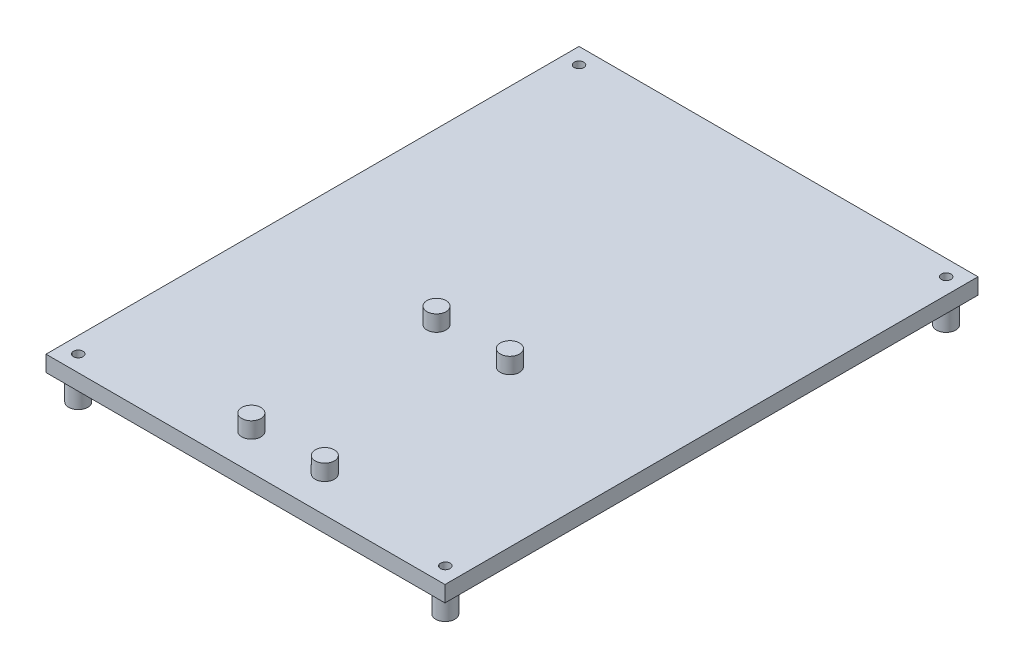
ISO-10303-21;
HEADER;
FILE_DESCRIPTION(('STEP AP214'),'2;1');
FILE_NAME('part.step','',(''),(''),'','','');
FILE_SCHEMA(('AUTOMOTIVE_DESIGN { 1 0 10303 214 1 1 1 1 }'));
ENDSEC;
DATA;
#1=APPLICATION_CONTEXT('core data for automotive mechanical design processes');
#2=APPLICATION_PROTOCOL_DEFINITION('international standard','automotive_design',2000,#1);
#3=PRODUCT_CONTEXT('',#1,'mechanical');
#4=PRODUCT('Part','Part','',(#3));
#5=PRODUCT_RELATED_PRODUCT_CATEGORY('part','',(#4));
#6=PRODUCT_DEFINITION_FORMATION('','',#4);
#7=PRODUCT_DEFINITION_CONTEXT('part definition',#1,'design');
#8=PRODUCT_DEFINITION('design','',#6,#7);
#9=PRODUCT_DEFINITION_SHAPE('','',#8);
#10=(LENGTH_UNIT() NAMED_UNIT(*) SI_UNIT(.MILLI.,.METRE.));
#11=(NAMED_UNIT(*) PLANE_ANGLE_UNIT() SI_UNIT($,.RADIAN.));
#12=(NAMED_UNIT(*) SI_UNIT($,.STERADIAN.) SOLID_ANGLE_UNIT());
#13=UNCERTAINTY_MEASURE_WITH_UNIT(LENGTH_MEASURE(1.E-05),#10,'distance_accuracy_value','');
#14=(GEOMETRIC_REPRESENTATION_CONTEXT(3) GLOBAL_UNCERTAINTY_ASSIGNED_CONTEXT((#13)) GLOBAL_UNIT_ASSIGNED_CONTEXT((#10,
#11,#12)) REPRESENTATION_CONTEXT('',''));
#15=CARTESIAN_POINT('',(0.,0.,0.));
#16=DIRECTION('',(0.,0.,1.));
#17=DIRECTION('',(1.,0.,0.));
#18=AXIS2_PLACEMENT_3D('',#15,#16,#17);
#19=CARTESIAN_POINT('',(62.5,5.,83.5));
#20=DIRECTION('',(-1.,0.,0.));
#21=DIRECTION('',(0.,0.,1.));
#22=AXIS2_PLACEMENT_3D('',#19,#20,#21);
#23=PLANE('',#22);
#24=DIRECTION('',(0.,0.,-1.));
#25=VECTOR('',#24,1.);
#26=CARTESIAN_POINT('',(62.5,0.,83.5));
#27=LINE('',#26,#25);
#28=CARTESIAN_POINT('',(62.5,0.,83.5));
#29=VERTEX_POINT('',#28);
#30=CARTESIAN_POINT('',(62.5,0.,-83.5));
#31=VERTEX_POINT('',#30);
#32=EDGE_CURVE('E108',#29,#31,#27,.T.);
#33=ORIENTED_EDGE('',*,*,#32,.T.);
#34=DIRECTION('',(0.,-1.,0.));
#35=VECTOR('',#34,1.);
#36=CARTESIAN_POINT('',(62.5,5.,-83.5));
#37=LINE('',#36,#35);
#38=CARTESIAN_POINT('',(62.5,5.,-83.5));
#39=VERTEX_POINT('',#38);
#40=EDGE_CURVE('E99',#39,#31,#37,.T.);
#41=ORIENTED_EDGE('',*,*,#40,.F.);
#42=DIRECTION('',(0.,0.,-1.));
#43=VECTOR('',#42,1.);
#44=CARTESIAN_POINT('',(62.5,5.,83.5));
#45=LINE('',#44,#43);
#46=CARTESIAN_POINT('',(62.5,5.,83.5));
#47=VERTEX_POINT('',#46);
#48=EDGE_CURVE('E93',#47,#39,#45,.T.);
#49=ORIENTED_EDGE('',*,*,#48,.F.);
#50=DIRECTION('',(0.,-1.,0.));
#51=VECTOR('',#50,1.);
#52=CARTESIAN_POINT('',(62.5,5.,83.5));
#53=LINE('',#52,#51);
#54=EDGE_CURVE('E104',#47,#29,#53,.T.);
#55=ORIENTED_EDGE('',*,*,#54,.T.);
#56=EDGE_LOOP('',(#33,#41,#49,#55));
#57=FACE_BOUND('',#56,.T.);
#58=ADVANCED_FACE('F41',(#57),#23,.F.);
#59=CARTESIAN_POINT('',(-62.5,5.,-83.5));
#60=DIRECTION('',(0.,0.,1.));
#61=DIRECTION('',(1.,0.,0.));
#62=AXIS2_PLACEMENT_3D('',#59,#60,#61);
#63=PLANE('',#62);
#64=DIRECTION('',(-1.,0.,0.));
#65=VECTOR('',#64,1.);
#66=CARTESIAN_POINT('',(-62.5,0.,-83.5));
#67=LINE('',#66,#65);
#68=CARTESIAN_POINT('',(-62.5,0.,-83.5));
#69=VERTEX_POINT('',#68);
#70=EDGE_CURVE('E98',#31,#69,#67,.T.);
#71=ORIENTED_EDGE('',*,*,#70,.T.);
#72=DIRECTION('',(0.,-1.,0.));
#73=VECTOR('',#72,1.);
#74=CARTESIAN_POINT('',(-62.5,5.,-83.5));
#75=LINE('',#74,#73);
#76=CARTESIAN_POINT('',(-62.5,5.,-83.5));
#77=VERTEX_POINT('',#76);
#78=EDGE_CURVE('E96',#77,#69,#75,.T.);
#79=ORIENTED_EDGE('',*,*,#78,.F.);
#80=DIRECTION('',(-1.,0.,0.));
#81=VECTOR('',#80,1.);
#82=CARTESIAN_POINT('',(-62.5,5.,-83.5));
#83=LINE('',#82,#81);
#84=EDGE_CURVE('E88',#39,#77,#83,.T.);
#85=ORIENTED_EDGE('',*,*,#84,.F.);
#86=ORIENTED_EDGE('',*,*,#40,.T.);
#87=EDGE_LOOP('',(#71,#79,#85,#86));
#88=FACE_BOUND('',#87,.T.);
#89=ADVANCED_FACE('F97',(#88),#63,.F.);
#90=CARTESIAN_POINT('',(-62.5,5.,83.5));
#91=DIRECTION('',(1.,0.,0.));
#92=DIRECTION('',(0.,0.,-1.));
#93=AXIS2_PLACEMENT_3D('',#90,#91,#92);
#94=PLANE('',#93);
#95=DIRECTION('',(0.,0.,1.));
#96=VECTOR('',#95,1.);
#97=CARTESIAN_POINT('',(-62.5,0.,83.5));
#98=LINE('',#97,#96);
#99=CARTESIAN_POINT('',(-62.5,0.,83.5));
#100=VERTEX_POINT('',#99);
#101=EDGE_CURVE('E74',#69,#100,#98,.T.);
#102=ORIENTED_EDGE('',*,*,#101,.T.);
#103=DIRECTION('',(0.,-1.,0.));
#104=VECTOR('',#103,1.);
#105=CARTESIAN_POINT('',(-62.5,5.,83.5));
#106=LINE('',#105,#104);
#107=CARTESIAN_POINT('',(-62.5,5.,83.5));
#108=VERTEX_POINT('',#107);
#109=EDGE_CURVE('E100',#108,#100,#106,.T.);
#110=ORIENTED_EDGE('',*,*,#109,.F.);
#111=DIRECTION('',(0.,0.,1.));
#112=VECTOR('',#111,1.);
#113=CARTESIAN_POINT('',(-62.5,5.,83.5));
#114=LINE('',#113,#112);
#115=EDGE_CURVE('E91',#77,#108,#114,.T.);
#116=ORIENTED_EDGE('',*,*,#115,.F.);
#117=ORIENTED_EDGE('',*,*,#78,.T.);
#118=EDGE_LOOP('',(#102,#110,#116,#117));
#119=FACE_BOUND('',#118,.T.);
#120=ADVANCED_FACE('F102',(#119),#94,.F.);
#121=CARTESIAN_POINT('',(-62.5,5.,83.5));
#122=DIRECTION('',(0.,0.,-1.));
#123=DIRECTION('',(-1.,0.,0.));
#124=AXIS2_PLACEMENT_3D('',#121,#122,#123);
#125=PLANE('',#124);
#126=DIRECTION('',(1.,0.,0.));
#127=VECTOR('',#126,1.);
#128=CARTESIAN_POINT('',(-62.5,0.,83.5));
#129=LINE('',#128,#127);
#130=EDGE_CURVE('E80',#100,#29,#129,.T.);
#131=ORIENTED_EDGE('',*,*,#130,.T.);
#132=ORIENTED_EDGE('',*,*,#54,.F.);
#133=DIRECTION('',(1.,0.,0.));
#134=VECTOR('',#133,1.);
#135=CARTESIAN_POINT('',(-62.5,5.,83.5));
#136=LINE('',#135,#134);
#137=EDGE_CURVE('E57',#108,#47,#136,.T.);
#138=ORIENTED_EDGE('',*,*,#137,.F.);
#139=ORIENTED_EDGE('',*,*,#109,.T.);
#140=EDGE_LOOP('',(#131,#132,#138,#139));
#141=FACE_BOUND('',#140,.T.);
#142=ADVANCED_FACE('F131',(#141),#125,.F.);
#143=CARTESIAN_POINT('',(0.,5.,0.));
#144=DIRECTION('',(0.,-1.,0.));
#145=DIRECTION('',(0.,0.,-1.));
#146=AXIS2_PLACEMENT_3D('',#143,#144,#145);
#147=PLANE('',#146);
#148=CARTESIAN_POINT('',(13.6315538342509,5.,72.2889562249022));
#149=DIRECTION('',(0.,-1.,0.));
#150=DIRECTION('',(0.,0.,-1.));
#151=AXIS2_PLACEMENT_3D('',#148,#149,#150);
#152=CIRCLE('',#151,3.);
#153=CARTESIAN_POINT('',(13.6315538342509,5.,69.2889562249022));
#154=VERTEX_POINT('',#153);
#155=EDGE_CURVE('E11',#154,#154,#152,.F.);
#156=ORIENTED_EDGE('',*,*,#155,.F.);
#157=EDGE_LOOP('',(#156));
#158=FACE_BOUND('',#157,.T.);
#159=CARTESIAN_POINT('',(13.6315538342509,5.,14.2889562249022));
#160=DIRECTION('',(0.,-1.,0.));
#161=DIRECTION('',(0.,0.,-1.));
#162=AXIS2_PLACEMENT_3D('',#159,#160,#161);
#163=CIRCLE('',#162,3.);
#164=CARTESIAN_POINT('',(13.6315538342509,5.,11.2889562249022));
#165=VERTEX_POINT('',#164);
#166=EDGE_CURVE('E49',#165,#165,#163,.F.);
#167=ORIENTED_EDGE('',*,*,#166,.F.);
#168=EDGE_LOOP('',(#167));
#169=FACE_BOUND('',#168,.T.);
#170=CARTESIAN_POINT('',(-9.36844616574911,5.,14.2889562249022));
#171=DIRECTION('',(0.,-1.,0.));
#172=DIRECTION('',(0.,0.,-1.));
#173=AXIS2_PLACEMENT_3D('',#170,#171,#172);
#174=CIRCLE('',#173,3.);
#175=CARTESIAN_POINT('',(-9.36844616574911,5.,11.2889562249022));
#176=VERTEX_POINT('',#175);
#177=EDGE_CURVE('E121',#176,#176,#174,.F.);
#178=ORIENTED_EDGE('',*,*,#177,.F.);
#179=EDGE_LOOP('',(#178));
#180=FACE_BOUND('',#179,.T.);
#181=CARTESIAN_POINT('',(-9.36844616574911,5.,72.2889562249022));
#182=DIRECTION('',(0.,-1.,0.));
#183=DIRECTION('',(0.,0.,-1.));
#184=AXIS2_PLACEMENT_3D('',#181,#182,#183);
#185=CIRCLE('',#184,3.);
#186=CARTESIAN_POINT('',(-9.36844616574911,5.,69.2889562249022));
#187=VERTEX_POINT('',#186);
#188=EDGE_CURVE('E118',#187,#187,#185,.F.);
#189=ORIENTED_EDGE('',*,*,#188,.F.);
#190=EDGE_LOOP('',(#189));
#191=FACE_BOUND('',#190,.T.);
#192=CARTESIAN_POINT('',(-57.5,5.,-78.5));
#193=DIRECTION('',(0.,-1.,0.));
#194=DIRECTION('',(0.,0.,-1.));
#195=AXIS2_PLACEMENT_3D('',#192,#193,#194);
#196=CIRCLE('',#195,1.5);
#197=CARTESIAN_POINT('',(-57.5,5.,-77.));
#198=VERTEX_POINT('',#197);
#199=EDGE_CURVE('E141',#198,#198,#196,.T.);
#200=ORIENTED_EDGE('',*,*,#199,.T.);
#201=EDGE_LOOP('',(#200));
#202=FACE_BOUND('',#201,.T.);
#203=CARTESIAN_POINT('',(57.5,5.,-78.5));
#204=DIRECTION('',(0.,-1.,0.));
#205=DIRECTION('',(0.,0.,-1.));
#206=AXIS2_PLACEMENT_3D('',#203,#204,#205);
#207=CIRCLE('',#206,1.5);
#208=CARTESIAN_POINT('',(57.5,5.,-77.));
#209=VERTEX_POINT('',#208);
#210=EDGE_CURVE('E145',#209,#209,#207,.T.);
#211=ORIENTED_EDGE('',*,*,#210,.T.);
#212=EDGE_LOOP('',(#211));
#213=FACE_BOUND('',#212,.T.);
#214=CARTESIAN_POINT('',(57.5,5.,78.4));
#215=DIRECTION('',(0.,-1.,0.));
#216=DIRECTION('',(0.,0.,-1.));
#217=AXIS2_PLACEMENT_3D('',#214,#215,#216);
#218=CIRCLE('',#217,1.5);
#219=CARTESIAN_POINT('',(57.5,5.,79.9));
#220=VERTEX_POINT('',#219);
#221=EDGE_CURVE('E149',#220,#220,#218,.T.);
#222=ORIENTED_EDGE('',*,*,#221,.T.);
#223=EDGE_LOOP('',(#222));
#224=FACE_BOUND('',#223,.T.);
#225=CARTESIAN_POINT('',(-57.5,5.,78.4));
#226=DIRECTION('',(0.,-1.,0.));
#227=DIRECTION('',(0.,0.,-1.));
#228=AXIS2_PLACEMENT_3D('',#225,#226,#227);
#229=CIRCLE('',#228,1.5);
#230=CARTESIAN_POINT('',(-57.5,5.,79.9));
#231=VERTEX_POINT('',#230);
#232=EDGE_CURVE('E111',#231,#231,#229,.T.);
#233=ORIENTED_EDGE('',*,*,#232,.T.);
#234=EDGE_LOOP('',(#233));
#235=FACE_BOUND('',#234,.T.);
#236=ORIENTED_EDGE('',*,*,#48,.T.);
#237=ORIENTED_EDGE('',*,*,#84,.T.);
#238=ORIENTED_EDGE('',*,*,#115,.T.);
#239=ORIENTED_EDGE('',*,*,#137,.T.);
#240=EDGE_LOOP('',(#236,#237,#238,#239));
#241=FACE_BOUND('',#240,.T.);
#242=ADVANCED_FACE('F89',(#158,#169,#180,#191,#202,#213,#224,#235,#241),#147,.F.);
#243=CARTESIAN_POINT('',(0.,0.,0.));
#244=DIRECTION('',(0.,-1.,0.));
#245=DIRECTION('',(0.,0.,-1.));
#246=AXIS2_PLACEMENT_3D('',#243,#244,#245);
#247=PLANE('',#246);
#248=CARTESIAN_POINT('',(-57.5,0.,-78.5));
#249=DIRECTION('',(0.,-1.,0.));
#250=DIRECTION('',(0.,0.,-1.));
#251=AXIS2_PLACEMENT_3D('',#248,#249,#250);
#252=CIRCLE('',#251,2.99215131836085);
#253=CARTESIAN_POINT('',(-57.5,0.,-81.4921513183609));
#254=VERTEX_POINT('',#253);
#255=EDGE_CURVE('E168',#254,#254,#252,.T.);
#256=ORIENTED_EDGE('',*,*,#255,.F.);
#257=EDGE_LOOP('',(#256));
#258=FACE_BOUND('',#257,.T.);
#259=CARTESIAN_POINT('',(57.5,0.,-78.5));
#260=DIRECTION('',(0.,-1.,0.));
#261=DIRECTION('',(0.,0.,-1.));
#262=AXIS2_PLACEMENT_3D('',#259,#260,#261);
#263=CIRCLE('',#262,2.99215131836085);
#264=CARTESIAN_POINT('',(57.5,0.,-81.4921513183609));
#265=VERTEX_POINT('',#264);
#266=EDGE_CURVE('E175',#265,#265,#263,.T.);
#267=ORIENTED_EDGE('',*,*,#266,.F.);
#268=EDGE_LOOP('',(#267));
#269=FACE_BOUND('',#268,.T.);
#270=CARTESIAN_POINT('',(57.5,0.,78.4));
#271=DIRECTION('',(0.,-1.,0.));
#272=DIRECTION('',(0.,0.,-1.));
#273=AXIS2_PLACEMENT_3D('',#270,#271,#272);
#274=CIRCLE('',#273,2.99215131836085);
#275=CARTESIAN_POINT('',(57.5,0.,75.4078486816392));
#276=VERTEX_POINT('',#275);
#277=EDGE_CURVE('E162',#276,#276,#274,.T.);
#278=ORIENTED_EDGE('',*,*,#277,.F.);
#279=EDGE_LOOP('',(#278));
#280=FACE_BOUND('',#279,.T.);
#281=CARTESIAN_POINT('',(-57.5,0.,78.4));
#282=DIRECTION('',(0.,-1.,0.));
#283=DIRECTION('',(0.,0.,-1.));
#284=AXIS2_PLACEMENT_3D('',#281,#282,#283);
#285=CIRCLE('',#284,2.99215131836085);
#286=CARTESIAN_POINT('',(-57.5,0.,75.4078486816392));
#287=VERTEX_POINT('',#286);
#288=EDGE_CURVE('E159',#287,#287,#285,.T.);
#289=ORIENTED_EDGE('',*,*,#288,.F.);
#290=EDGE_LOOP('',(#289));
#291=FACE_BOUND('',#290,.T.);
#292=ORIENTED_EDGE('',*,*,#32,.F.);
#293=ORIENTED_EDGE('',*,*,#130,.F.);
#294=ORIENTED_EDGE('',*,*,#101,.F.);
#295=ORIENTED_EDGE('',*,*,#70,.F.);
#296=EDGE_LOOP('',(#292,#293,#294,#295));
#297=FACE_BOUND('',#296,.T.);
#298=ADVANCED_FACE('F130',(#258,#269,#280,#291,#297),#247,.T.);
#299=CARTESIAN_POINT('',(-57.5,-1.2E-05,78.4));
#300=DIRECTION('',(0.,1.,0.));
#301=DIRECTION('',(0.,0.,1.));
#302=AXIS2_PLACEMENT_3D('',#299,#300,#301);
#303=CYLINDRICAL_SURFACE('',#302,1.5);
#304=CARTESIAN_POINT('',(-57.5,-8.,78.4));
#305=DIRECTION('',(0.,1.,0.));
#306=DIRECTION('',(0.,0.,1.));
#307=AXIS2_PLACEMENT_3D('',#304,#305,#306);
#308=CIRCLE('',#307,1.5);
#309=CARTESIAN_POINT('',(-57.5,-8.,79.9));
#310=VERTEX_POINT('',#309);
#311=EDGE_CURVE('E186',#310,#310,#308,.T.);
#312=CARTESIAN_POINT('',(-57.5,5.,79.9));
#313=CARTESIAN_POINT('',(-57.5,4.86458333333333,79.9));
#314=CARTESIAN_POINT('',(-57.5,4.72916666666667,79.9));
#315=CARTESIAN_POINT('',(-57.5,4.45833333333333,79.9));
#316=CARTESIAN_POINT('',(-57.5,4.32291666666667,79.9));
#317=CARTESIAN_POINT('',(-57.5,4.05208333333333,79.9));
#318=CARTESIAN_POINT('',(-57.5,3.91666666666667,79.9));
#319=CARTESIAN_POINT('',(-57.5,3.64583333333333,79.9));
#320=CARTESIAN_POINT('',(-57.5,3.51041666666667,79.9));
#321=CARTESIAN_POINT('',(-57.5,3.23958333333333,79.9));
#322=CARTESIAN_POINT('',(-57.5,3.10416666666667,79.9));
#323=CARTESIAN_POINT('',(-57.5,2.83333333333333,79.9));
#324=CARTESIAN_POINT('',(-57.5,2.69791666666667,79.9));
#325=CARTESIAN_POINT('',(-57.5,2.42708333333333,79.9));
#326=CARTESIAN_POINT('',(-57.5,2.29166666666667,79.9));
#327=CARTESIAN_POINT('',(-57.5,2.02083333333333,79.9));
#328=CARTESIAN_POINT('',(-57.5,1.88541666666667,79.9));
#329=CARTESIAN_POINT('',(-57.5,1.61458333333333,79.9));
#330=CARTESIAN_POINT('',(-57.5,1.47916666666667,79.9));
#331=CARTESIAN_POINT('',(-57.5,1.20833333333333,79.9));
#332=CARTESIAN_POINT('',(-57.5,1.07291666666667,79.9));
#333=CARTESIAN_POINT('',(-57.5,0.802083333333333,79.9));
#334=CARTESIAN_POINT('',(-57.5,0.666666666666667,79.9));
#335=CARTESIAN_POINT('',(-57.5,0.395833333333333,79.9));
#336=CARTESIAN_POINT('',(-57.5,0.260416666666667,79.9));
#337=CARTESIAN_POINT('',(-57.5,-0.0104166666666669,79.9));
#338=CARTESIAN_POINT('',(-57.5,-0.145833333333334,79.9));
#339=CARTESIAN_POINT('',(-57.5,-0.416666666666667,79.9));
#340=CARTESIAN_POINT('',(-57.5,-0.552083333333333,79.9));
#341=CARTESIAN_POINT('',(-57.5,-0.822916666666667,79.9));
#342=CARTESIAN_POINT('',(-57.5,-0.958333333333333,79.9));
#343=CARTESIAN_POINT('',(-57.5,-1.22916666666667,79.9));
#344=CARTESIAN_POINT('',(-57.5,-1.36458333333333,79.9));
#345=CARTESIAN_POINT('',(-57.5,-1.63541666666667,79.9));
#346=CARTESIAN_POINT('',(-57.5,-1.77083333333333,79.9));
#347=CARTESIAN_POINT('',(-57.5,-2.04166666666667,79.9));
#348=CARTESIAN_POINT('',(-57.5,-2.17708333333333,79.9));
#349=CARTESIAN_POINT('',(-57.5,-2.44791666666667,79.9));
#350=CARTESIAN_POINT('',(-57.5,-2.58333333333333,79.9));
#351=CARTESIAN_POINT('',(-57.5,-2.85416666666667,79.9));
#352=CARTESIAN_POINT('',(-57.5,-2.98958333333333,79.9));
#353=CARTESIAN_POINT('',(-57.5,-3.26041666666667,79.9));
#354=CARTESIAN_POINT('',(-57.5,-3.39583333333333,79.9));
#355=CARTESIAN_POINT('',(-57.5,-3.66666666666667,79.9));
#356=CARTESIAN_POINT('',(-57.5,-3.80208333333333,79.9));
#357=CARTESIAN_POINT('',(-57.5,-4.07291666666667,79.9));
#358=CARTESIAN_POINT('',(-57.5,-4.20833333333333,79.9));
#359=CARTESIAN_POINT('',(-57.5,-4.47916666666667,79.9));
#360=CARTESIAN_POINT('',(-57.5,-4.61458333333333,79.9));
#361=CARTESIAN_POINT('',(-57.5,-4.88541666666667,79.9));
#362=CARTESIAN_POINT('',(-57.5,-5.02083333333333,79.9));
#363=CARTESIAN_POINT('',(-57.5,-5.29166666666667,79.9));
#364=CARTESIAN_POINT('',(-57.5,-5.42708333333333,79.9));
#365=CARTESIAN_POINT('',(-57.5,-5.69791666666667,79.9));
#366=CARTESIAN_POINT('',(-57.5,-5.83333333333334,79.9));
#367=CARTESIAN_POINT('',(-57.5,-6.10416666666667,79.9));
#368=CARTESIAN_POINT('',(-57.5,-6.23958333333333,79.9));
#369=CARTESIAN_POINT('',(-57.5,-6.51041666666667,79.9));
#370=CARTESIAN_POINT('',(-57.5,-6.64583333333333,79.9));
#371=CARTESIAN_POINT('',(-57.5,-6.91666666666667,79.9));
#372=CARTESIAN_POINT('',(-57.5,-7.05208333333333,79.9));
#373=CARTESIAN_POINT('',(-57.5,-7.32291666666667,79.9));
#374=CARTESIAN_POINT('',(-57.5,-7.45833333333333,79.9));
#375=CARTESIAN_POINT('',(-57.5,-7.72916666666667,79.9));
#376=CARTESIAN_POINT('',(-57.5,-7.86458333333333,79.9));
#377=CARTESIAN_POINT('',(-57.5,-8.,79.9));
#378=B_SPLINE_CURVE_WITH_KNOTS('',3,(#312,#313,#314,#315,#316,#317,#318,#319,#320,#321,#322,
#323,#324,#325,#326,#327,#328,#329,#330,#331,#332,#333,#334,#335,#336,#337,#338,#339,#340,#341,
#342,#343,#344,#345,#346,#347,#348,#349,#350,#351,#352,#353,#354,#355,#356,#357,#358,#359,#360,
#361,#362,#363,#364,#365,#366,#367,#368,#369,#370,#371,#372,#373,#374,#375,#376,#377),
.UNSPECIFIED.,.F.,.F.,(4,2,2,2,2,2,2,2,2,2,2,2,2,2,2,2,2,2,2,2,2,2,2,2,2,2,2,2,2,2,2,2,4),(0.,
0.40625,0.812500000000001,1.21875,1.625,2.03125,2.4375,2.84375,3.25,3.65625,4.0625,4.46875,
4.875,5.28125,5.6875,6.09375,6.5,6.90625,7.3125,7.71875,8.125,8.53125,8.9375,9.34375,9.75,
10.15625,10.5625,10.96875,11.375,11.78125,12.1875,12.59375,13.),.UNSPECIFIED.);
#379=EDGE_CURVE('BSEAM230',#231,#310,#378,.T.);
#380=ORIENTED_EDGE('',*,*,#232,.F.);
#381=ORIENTED_EDGE('',*,*,#311,.F.);
#382=ORIENTED_EDGE('',*,*,#379,.T.);
#383=ORIENTED_EDGE('',*,*,#379,.F.);
#384=EDGE_LOOP('',(#380,#382,#381,#383));
#385=FACE_BOUND('',#384,.T.);
#386=ADVANCED_FACE('F230',(#385),#303,.F.);
#387=CARTESIAN_POINT('',(57.5,-1.2E-05,78.4));
#388=DIRECTION('',(0.,1.,0.));
#389=DIRECTION('',(0.,0.,1.));
#390=AXIS2_PLACEMENT_3D('',#387,#388,#389);
#391=CYLINDRICAL_SURFACE('',#390,1.5);
#392=CARTESIAN_POINT('',(57.5,-8.,78.4));
#393=DIRECTION('',(0.,1.,0.));
#394=DIRECTION('',(0.,0.,1.));
#395=AXIS2_PLACEMENT_3D('',#392,#393,#394);
#396=CIRCLE('',#395,1.5);
#397=CARTESIAN_POINT('',(57.5,-8.,79.9));
#398=VERTEX_POINT('',#397);
#399=EDGE_CURVE('E189',#398,#398,#396,.T.);
#400=CARTESIAN_POINT('',(57.5,5.,79.9));
#401=CARTESIAN_POINT('',(57.5,4.86458333333333,79.9));
#402=CARTESIAN_POINT('',(57.5,4.72916666666667,79.9));
#403=CARTESIAN_POINT('',(57.5,4.45833333333333,79.9));
#404=CARTESIAN_POINT('',(57.5,4.32291666666667,79.9));
#405=CARTESIAN_POINT('',(57.5,4.05208333333333,79.9));
#406=CARTESIAN_POINT('',(57.5,3.91666666666667,79.9));
#407=CARTESIAN_POINT('',(57.5,3.64583333333333,79.9));
#408=CARTESIAN_POINT('',(57.5,3.51041666666667,79.9));
#409=CARTESIAN_POINT('',(57.5,3.23958333333333,79.9));
#410=CARTESIAN_POINT('',(57.5,3.10416666666667,79.9));
#411=CARTESIAN_POINT('',(57.5,2.83333333333333,79.9));
#412=CARTESIAN_POINT('',(57.5,2.69791666666667,79.9));
#413=CARTESIAN_POINT('',(57.5,2.42708333333333,79.9));
#414=CARTESIAN_POINT('',(57.5,2.29166666666667,79.9));
#415=CARTESIAN_POINT('',(57.5,2.02083333333333,79.9));
#416=CARTESIAN_POINT('',(57.5,1.88541666666667,79.9));
#417=CARTESIAN_POINT('',(57.5,1.61458333333333,79.9));
#418=CARTESIAN_POINT('',(57.5,1.47916666666667,79.9));
#419=CARTESIAN_POINT('',(57.5,1.20833333333333,79.9));
#420=CARTESIAN_POINT('',(57.5,1.07291666666667,79.9));
#421=CARTESIAN_POINT('',(57.5,0.802083333333333,79.9));
#422=CARTESIAN_POINT('',(57.5,0.666666666666667,79.9));
#423=CARTESIAN_POINT('',(57.5,0.395833333333333,79.9));
#424=CARTESIAN_POINT('',(57.5,0.260416666666667,79.9));
#425=CARTESIAN_POINT('',(57.5,-0.0104166666666669,79.9));
#426=CARTESIAN_POINT('',(57.5,-0.145833333333334,79.9));
#427=CARTESIAN_POINT('',(57.5,-0.416666666666667,79.9));
#428=CARTESIAN_POINT('',(57.5,-0.552083333333333,79.9));
#429=CARTESIAN_POINT('',(57.5,-0.822916666666667,79.9));
#430=CARTESIAN_POINT('',(57.5,-0.958333333333333,79.9));
#431=CARTESIAN_POINT('',(57.5,-1.22916666666667,79.9));
#432=CARTESIAN_POINT('',(57.5,-1.36458333333333,79.9));
#433=CARTESIAN_POINT('',(57.5,-1.63541666666667,79.9));
#434=CARTESIAN_POINT('',(57.5,-1.77083333333333,79.9));
#435=CARTESIAN_POINT('',(57.5,-2.04166666666667,79.9));
#436=CARTESIAN_POINT('',(57.5,-2.17708333333333,79.9));
#437=CARTESIAN_POINT('',(57.5,-2.44791666666667,79.9));
#438=CARTESIAN_POINT('',(57.5,-2.58333333333333,79.9));
#439=CARTESIAN_POINT('',(57.5,-2.85416666666667,79.9));
#440=CARTESIAN_POINT('',(57.5,-2.98958333333333,79.9));
#441=CARTESIAN_POINT('',(57.5,-3.26041666666667,79.9));
#442=CARTESIAN_POINT('',(57.5,-3.39583333333333,79.9));
#443=CARTESIAN_POINT('',(57.5,-3.66666666666667,79.9));
#444=CARTESIAN_POINT('',(57.5,-3.80208333333333,79.9));
#445=CARTESIAN_POINT('',(57.5,-4.07291666666667,79.9));
#446=CARTESIAN_POINT('',(57.5,-4.20833333333333,79.9));
#447=CARTESIAN_POINT('',(57.5,-4.47916666666667,79.9));
#448=CARTESIAN_POINT('',(57.5,-4.61458333333333,79.9));
#449=CARTESIAN_POINT('',(57.5,-4.88541666666667,79.9));
#450=CARTESIAN_POINT('',(57.5,-5.02083333333333,79.9));
#451=CARTESIAN_POINT('',(57.5,-5.29166666666667,79.9));
#452=CARTESIAN_POINT('',(57.5,-5.42708333333333,79.9));
#453=CARTESIAN_POINT('',(57.5,-5.69791666666667,79.9));
#454=CARTESIAN_POINT('',(57.5,-5.83333333333334,79.9));
#455=CARTESIAN_POINT('',(57.5,-6.10416666666667,79.9));
#456=CARTESIAN_POINT('',(57.5,-6.23958333333333,79.9));
#457=CARTESIAN_POINT('',(57.5,-6.51041666666667,79.9));
#458=CARTESIAN_POINT('',(57.5,-6.64583333333333,79.9));
#459=CARTESIAN_POINT('',(57.5,-6.91666666666667,79.9));
#460=CARTESIAN_POINT('',(57.5,-7.05208333333333,79.9));
#461=CARTESIAN_POINT('',(57.5,-7.32291666666667,79.9));
#462=CARTESIAN_POINT('',(57.5,-7.45833333333333,79.9));
#463=CARTESIAN_POINT('',(57.5,-7.72916666666667,79.9));
#464=CARTESIAN_POINT('',(57.5,-7.86458333333333,79.9));
#465=CARTESIAN_POINT('',(57.5,-8.,79.9));
#466=B_SPLINE_CURVE_WITH_KNOTS('',3,(#400,#401,#402,#403,#404,#405,#406,#407,#408,#409,#410,
#411,#412,#413,#414,#415,#416,#417,#418,#419,#420,#421,#422,#423,#424,#425,#426,#427,#428,#429,
#430,#431,#432,#433,#434,#435,#436,#437,#438,#439,#440,#441,#442,#443,#444,#445,#446,#447,#448,
#449,#450,#451,#452,#453,#454,#455,#456,#457,#458,#459,#460,#461,#462,#463,#464,#465),
.UNSPECIFIED.,.F.,.F.,(4,2,2,2,2,2,2,2,2,2,2,2,2,2,2,2,2,2,2,2,2,2,2,2,2,2,2,2,2,2,2,2,4),(0.,
0.40625,0.812500000000001,1.21875,1.625,2.03125,2.4375,2.84375,3.25,3.65625,4.0625,4.46875,
4.875,5.28125,5.6875,6.09375,6.5,6.90625,7.3125,7.71875,8.125,8.53125,8.9375,9.34375,9.75,
10.15625,10.5625,10.96875,11.375,11.78125,12.1875,12.59375,13.),.UNSPECIFIED.);
#467=EDGE_CURVE('BSEAM238',#220,#398,#466,.T.);
#468=ORIENTED_EDGE('',*,*,#221,.F.);
#469=ORIENTED_EDGE('',*,*,#399,.F.);
#470=ORIENTED_EDGE('',*,*,#467,.T.);
#471=ORIENTED_EDGE('',*,*,#467,.F.);
#472=EDGE_LOOP('',(#468,#470,#469,#471));
#473=FACE_BOUND('',#472,.T.);
#474=ADVANCED_FACE('F238',(#473),#391,.F.);
#475=CARTESIAN_POINT('',(57.5,-1.2E-05,-78.5));
#476=DIRECTION('',(0.,1.,0.));
#477=DIRECTION('',(0.,0.,1.));
#478=AXIS2_PLACEMENT_3D('',#475,#476,#477);
#479=CYLINDRICAL_SURFACE('',#478,1.5);
#480=CARTESIAN_POINT('',(57.5,-8.,-78.5));
#481=DIRECTION('',(0.,1.,0.));
#482=DIRECTION('',(0.,0.,1.));
#483=AXIS2_PLACEMENT_3D('',#480,#481,#482);
#484=CIRCLE('',#483,1.5);
#485=CARTESIAN_POINT('',(57.5,-8.,-77.));
#486=VERTEX_POINT('',#485);
#487=EDGE_CURVE('E185',#486,#486,#484,.T.);
#488=CARTESIAN_POINT('',(57.5,5.,-77.));
#489=CARTESIAN_POINT('',(57.5,4.86458333333333,-77.));
#490=CARTESIAN_POINT('',(57.5,4.72916666666667,-77.));
#491=CARTESIAN_POINT('',(57.5,4.45833333333333,-77.));
#492=CARTESIAN_POINT('',(57.5,4.32291666666667,-77.));
#493=CARTESIAN_POINT('',(57.5,4.05208333333333,-77.));
#494=CARTESIAN_POINT('',(57.5,3.91666666666667,-77.));
#495=CARTESIAN_POINT('',(57.5,3.64583333333333,-77.));
#496=CARTESIAN_POINT('',(57.5,3.51041666666667,-77.));
#497=CARTESIAN_POINT('',(57.5,3.23958333333333,-77.));
#498=CARTESIAN_POINT('',(57.5,3.10416666666667,-77.));
#499=CARTESIAN_POINT('',(57.5,2.83333333333333,-77.));
#500=CARTESIAN_POINT('',(57.5,2.69791666666667,-77.));
#501=CARTESIAN_POINT('',(57.5,2.42708333333333,-77.));
#502=CARTESIAN_POINT('',(57.5,2.29166666666667,-77.));
#503=CARTESIAN_POINT('',(57.5,2.02083333333333,-77.));
#504=CARTESIAN_POINT('',(57.5,1.88541666666667,-77.));
#505=CARTESIAN_POINT('',(57.5,1.61458333333333,-77.));
#506=CARTESIAN_POINT('',(57.5,1.47916666666667,-77.));
#507=CARTESIAN_POINT('',(57.5,1.20833333333333,-77.));
#508=CARTESIAN_POINT('',(57.5,1.07291666666667,-77.));
#509=CARTESIAN_POINT('',(57.5,0.802083333333333,-77.));
#510=CARTESIAN_POINT('',(57.5,0.666666666666667,-77.));
#511=CARTESIAN_POINT('',(57.5,0.395833333333333,-77.));
#512=CARTESIAN_POINT('',(57.5,0.260416666666667,-77.));
#513=CARTESIAN_POINT('',(57.5,-0.0104166666666669,-77.));
#514=CARTESIAN_POINT('',(57.5,-0.145833333333334,-77.));
#515=CARTESIAN_POINT('',(57.5,-0.416666666666667,-77.));
#516=CARTESIAN_POINT('',(57.5,-0.552083333333333,-77.));
#517=CARTESIAN_POINT('',(57.5,-0.822916666666667,-77.));
#518=CARTESIAN_POINT('',(57.5,-0.958333333333333,-77.));
#519=CARTESIAN_POINT('',(57.5,-1.22916666666667,-77.));
#520=CARTESIAN_POINT('',(57.5,-1.36458333333333,-77.));
#521=CARTESIAN_POINT('',(57.5,-1.63541666666667,-77.));
#522=CARTESIAN_POINT('',(57.5,-1.77083333333333,-77.));
#523=CARTESIAN_POINT('',(57.5,-2.04166666666667,-77.));
#524=CARTESIAN_POINT('',(57.5,-2.17708333333333,-77.));
#525=CARTESIAN_POINT('',(57.5,-2.44791666666667,-77.));
#526=CARTESIAN_POINT('',(57.5,-2.58333333333333,-77.));
#527=CARTESIAN_POINT('',(57.5,-2.85416666666667,-77.));
#528=CARTESIAN_POINT('',(57.5,-2.98958333333333,-77.));
#529=CARTESIAN_POINT('',(57.5,-3.26041666666667,-77.));
#530=CARTESIAN_POINT('',(57.5,-3.39583333333333,-77.));
#531=CARTESIAN_POINT('',(57.5,-3.66666666666667,-77.));
#532=CARTESIAN_POINT('',(57.5,-3.80208333333333,-77.));
#533=CARTESIAN_POINT('',(57.5,-4.07291666666667,-77.));
#534=CARTESIAN_POINT('',(57.5,-4.20833333333333,-77.));
#535=CARTESIAN_POINT('',(57.5,-4.47916666666667,-77.));
#536=CARTESIAN_POINT('',(57.5,-4.61458333333333,-77.));
#537=CARTESIAN_POINT('',(57.5,-4.88541666666667,-77.));
#538=CARTESIAN_POINT('',(57.5,-5.02083333333333,-77.));
#539=CARTESIAN_POINT('',(57.5,-5.29166666666667,-77.));
#540=CARTESIAN_POINT('',(57.5,-5.42708333333333,-77.));
#541=CARTESIAN_POINT('',(57.5,-5.69791666666667,-77.));
#542=CARTESIAN_POINT('',(57.5,-5.83333333333334,-77.));
#543=CARTESIAN_POINT('',(57.5,-6.10416666666667,-77.));
#544=CARTESIAN_POINT('',(57.5,-6.23958333333333,-77.));
#545=CARTESIAN_POINT('',(57.5,-6.51041666666667,-77.));
#546=CARTESIAN_POINT('',(57.5,-6.64583333333333,-77.));
#547=CARTESIAN_POINT('',(57.5,-6.91666666666667,-77.));
#548=CARTESIAN_POINT('',(57.5,-7.05208333333333,-77.));
#549=CARTESIAN_POINT('',(57.5,-7.32291666666667,-77.));
#550=CARTESIAN_POINT('',(57.5,-7.45833333333333,-77.));
#551=CARTESIAN_POINT('',(57.5,-7.72916666666667,-77.));
#552=CARTESIAN_POINT('',(57.5,-7.86458333333333,-77.));
#553=CARTESIAN_POINT('',(57.5,-8.,-77.));
#554=B_SPLINE_CURVE_WITH_KNOTS('',3,(#488,#489,#490,#491,#492,#493,#494,#495,#496,#497,#498,
#499,#500,#501,#502,#503,#504,#505,#506,#507,#508,#509,#510,#511,#512,#513,#514,#515,#516,#517,
#518,#519,#520,#521,#522,#523,#524,#525,#526,#527,#528,#529,#530,#531,#532,#533,#534,#535,#536,
#537,#538,#539,#540,#541,#542,#543,#544,#545,#546,#547,#548,#549,#550,#551,#552,#553),
.UNSPECIFIED.,.F.,.F.,(4,2,2,2,2,2,2,2,2,2,2,2,2,2,2,2,2,2,2,2,2,2,2,2,2,2,2,2,2,2,2,2,4),(0.,
0.40625,0.812500000000001,1.21875,1.625,2.03125,2.4375,2.84375,3.25,3.65625,4.0625,4.46875,
4.875,5.28125,5.6875,6.09375,6.5,6.90625,7.3125,7.71875,8.125,8.53125,8.9375,9.34375,9.75,
10.15625,10.5625,10.96875,11.375,11.78125,12.1875,12.59375,13.),.UNSPECIFIED.);
#555=EDGE_CURVE('BSEAM286',#209,#486,#554,.T.);
#556=ORIENTED_EDGE('',*,*,#210,.F.);
#557=ORIENTED_EDGE('',*,*,#487,.F.);
#558=ORIENTED_EDGE('',*,*,#555,.T.);
#559=ORIENTED_EDGE('',*,*,#555,.F.);
#560=EDGE_LOOP('',(#556,#558,#557,#559));
#561=FACE_BOUND('',#560,.T.);
#562=ADVANCED_FACE('F286',(#561),#479,.F.);
#563=CARTESIAN_POINT('',(-57.5,-1.2E-05,-78.5));
#564=DIRECTION('',(0.,1.,0.));
#565=DIRECTION('',(0.,0.,1.));
#566=AXIS2_PLACEMENT_3D('',#563,#564,#565);
#567=CYLINDRICAL_SURFACE('',#566,1.5);
#568=CARTESIAN_POINT('',(-57.5,-8.,-78.5));
#569=DIRECTION('',(0.,1.,0.));
#570=DIRECTION('',(0.,0.,1.));
#571=AXIS2_PLACEMENT_3D('',#568,#569,#570);
#572=CIRCLE('',#571,1.5);
#573=CARTESIAN_POINT('',(-57.5,-8.,-77.));
#574=VERTEX_POINT('',#573);
#575=EDGE_CURVE('E169',#574,#574,#572,.T.);
#576=CARTESIAN_POINT('',(-57.5,5.,-77.));
#577=CARTESIAN_POINT('',(-57.5,4.86458333333333,-77.));
#578=CARTESIAN_POINT('',(-57.5,4.72916666666667,-77.));
#579=CARTESIAN_POINT('',(-57.5,4.45833333333333,-77.));
#580=CARTESIAN_POINT('',(-57.5,4.32291666666667,-77.));
#581=CARTESIAN_POINT('',(-57.5,4.05208333333333,-77.));
#582=CARTESIAN_POINT('',(-57.5,3.91666666666667,-77.));
#583=CARTESIAN_POINT('',(-57.5,3.64583333333333,-77.));
#584=CARTESIAN_POINT('',(-57.5,3.51041666666667,-77.));
#585=CARTESIAN_POINT('',(-57.5,3.23958333333333,-77.));
#586=CARTESIAN_POINT('',(-57.5,3.10416666666667,-77.));
#587=CARTESIAN_POINT('',(-57.5,2.83333333333333,-77.));
#588=CARTESIAN_POINT('',(-57.5,2.69791666666667,-77.));
#589=CARTESIAN_POINT('',(-57.5,2.42708333333333,-77.));
#590=CARTESIAN_POINT('',(-57.5,2.29166666666667,-77.));
#591=CARTESIAN_POINT('',(-57.5,2.02083333333333,-77.));
#592=CARTESIAN_POINT('',(-57.5,1.88541666666667,-77.));
#593=CARTESIAN_POINT('',(-57.5,1.61458333333333,-77.));
#594=CARTESIAN_POINT('',(-57.5,1.47916666666667,-77.));
#595=CARTESIAN_POINT('',(-57.5,1.20833333333333,-77.));
#596=CARTESIAN_POINT('',(-57.5,1.07291666666667,-77.));
#597=CARTESIAN_POINT('',(-57.5,0.802083333333333,-77.));
#598=CARTESIAN_POINT('',(-57.5,0.666666666666667,-77.));
#599=CARTESIAN_POINT('',(-57.5,0.395833333333333,-77.));
#600=CARTESIAN_POINT('',(-57.5,0.260416666666667,-77.));
#601=CARTESIAN_POINT('',(-57.5,-0.0104166666666669,-77.));
#602=CARTESIAN_POINT('',(-57.5,-0.145833333333334,-77.));
#603=CARTESIAN_POINT('',(-57.5,-0.416666666666667,-77.));
#604=CARTESIAN_POINT('',(-57.5,-0.552083333333333,-77.));
#605=CARTESIAN_POINT('',(-57.5,-0.822916666666667,-77.));
#606=CARTESIAN_POINT('',(-57.5,-0.958333333333333,-77.));
#607=CARTESIAN_POINT('',(-57.5,-1.22916666666667,-77.));
#608=CARTESIAN_POINT('',(-57.5,-1.36458333333333,-77.));
#609=CARTESIAN_POINT('',(-57.5,-1.63541666666667,-77.));
#610=CARTESIAN_POINT('',(-57.5,-1.77083333333333,-77.));
#611=CARTESIAN_POINT('',(-57.5,-2.04166666666667,-77.));
#612=CARTESIAN_POINT('',(-57.5,-2.17708333333333,-77.));
#613=CARTESIAN_POINT('',(-57.5,-2.44791666666667,-77.));
#614=CARTESIAN_POINT('',(-57.5,-2.58333333333333,-77.));
#615=CARTESIAN_POINT('',(-57.5,-2.85416666666667,-77.));
#616=CARTESIAN_POINT('',(-57.5,-2.98958333333333,-77.));
#617=CARTESIAN_POINT('',(-57.5,-3.26041666666667,-77.));
#618=CARTESIAN_POINT('',(-57.5,-3.39583333333333,-77.));
#619=CARTESIAN_POINT('',(-57.5,-3.66666666666667,-77.));
#620=CARTESIAN_POINT('',(-57.5,-3.80208333333333,-77.));
#621=CARTESIAN_POINT('',(-57.5,-4.07291666666667,-77.));
#622=CARTESIAN_POINT('',(-57.5,-4.20833333333333,-77.));
#623=CARTESIAN_POINT('',(-57.5,-4.47916666666667,-77.));
#624=CARTESIAN_POINT('',(-57.5,-4.61458333333333,-77.));
#625=CARTESIAN_POINT('',(-57.5,-4.88541666666667,-77.));
#626=CARTESIAN_POINT('',(-57.5,-5.02083333333333,-77.));
#627=CARTESIAN_POINT('',(-57.5,-5.29166666666667,-77.));
#628=CARTESIAN_POINT('',(-57.5,-5.42708333333333,-77.));
#629=CARTESIAN_POINT('',(-57.5,-5.69791666666667,-77.));
#630=CARTESIAN_POINT('',(-57.5,-5.83333333333334,-77.));
#631=CARTESIAN_POINT('',(-57.5,-6.10416666666667,-77.));
#632=CARTESIAN_POINT('',(-57.5,-6.23958333333333,-77.));
#633=CARTESIAN_POINT('',(-57.5,-6.51041666666667,-77.));
#634=CARTESIAN_POINT('',(-57.5,-6.64583333333333,-77.));
#635=CARTESIAN_POINT('',(-57.5,-6.91666666666667,-77.));
#636=CARTESIAN_POINT('',(-57.5,-7.05208333333333,-77.));
#637=CARTESIAN_POINT('',(-57.5,-7.32291666666667,-77.));
#638=CARTESIAN_POINT('',(-57.5,-7.45833333333333,-77.));
#639=CARTESIAN_POINT('',(-57.5,-7.72916666666667,-77.));
#640=CARTESIAN_POINT('',(-57.5,-7.86458333333333,-77.));
#641=CARTESIAN_POINT('',(-57.5,-8.,-77.));
#642=B_SPLINE_CURVE_WITH_KNOTS('',3,(#576,#577,#578,#579,#580,#581,#582,#583,#584,#585,#586,
#587,#588,#589,#590,#591,#592,#593,#594,#595,#596,#597,#598,#599,#600,#601,#602,#603,#604,#605,
#606,#607,#608,#609,#610,#611,#612,#613,#614,#615,#616,#617,#618,#619,#620,#621,#622,#623,#624,
#625,#626,#627,#628,#629,#630,#631,#632,#633,#634,#635,#636,#637,#638,#639,#640,#641),
.UNSPECIFIED.,.F.,.F.,(4,2,2,2,2,2,2,2,2,2,2,2,2,2,2,2,2,2,2,2,2,2,2,2,2,2,2,2,2,2,2,2,4),(0.,
0.40625,0.812500000000001,1.21875,1.625,2.03125,2.4375,2.84375,3.25,3.65625,4.0625,4.46875,
4.875,5.28125,5.6875,6.09375,6.5,6.90625,7.3125,7.71875,8.125,8.53125,8.9375,9.34375,9.75,
10.15625,10.5625,10.96875,11.375,11.78125,12.1875,12.59375,13.),.UNSPECIFIED.);
#643=EDGE_CURVE('BSEAM298',#198,#574,#642,.T.);
#644=ORIENTED_EDGE('',*,*,#199,.F.);
#645=ORIENTED_EDGE('',*,*,#575,.F.);
#646=ORIENTED_EDGE('',*,*,#643,.T.);
#647=ORIENTED_EDGE('',*,*,#643,.F.);
#648=EDGE_LOOP('',(#644,#646,#645,#647));
#649=FACE_BOUND('',#648,.T.);
#650=ADVANCED_FACE('F298',(#649),#567,.F.);
#651=CARTESIAN_POINT('',(-57.5,-8.,78.4));
#652=DIRECTION('',(0.,1.,0.));
#653=DIRECTION('',(0.,0.,1.));
#654=AXIS2_PLACEMENT_3D('',#651,#652,#653);
#655=CYLINDRICAL_SURFACE('',#654,2.99215131836085);
#656=CARTESIAN_POINT('',(-57.5,-8.,78.4));
#657=DIRECTION('',(0.,-1.,0.));
#658=DIRECTION('',(0.,0.,-1.));
#659=AXIS2_PLACEMENT_3D('',#656,#657,#658);
#660=CIRCLE('',#659,2.99215131836085);
#661=CARTESIAN_POINT('',(-57.5,-8.,75.4078486816392));
#662=VERTEX_POINT('',#661);
#663=EDGE_CURVE('E157',#662,#662,#660,.T.);
#664=ORIENTED_EDGE('',*,*,#663,.F.);
#665=EDGE_LOOP('',(#664));
#666=FACE_BOUND('',#665,.T.);
#667=ORIENTED_EDGE('',*,*,#288,.T.);
#668=EDGE_LOOP('',(#667));
#669=FACE_BOUND('',#668,.T.);
#670=ADVANCED_FACE('F310',(#666,#669),#655,.T.);
#671=CARTESIAN_POINT('',(-57.5,-8.,78.4));
#672=DIRECTION('',(0.,-1.,0.));
#673=DIRECTION('',(0.,0.,-1.));
#674=AXIS2_PLACEMENT_3D('',#671,#672,#673);
#675=PLANE('',#674);
#676=ORIENTED_EDGE('',*,*,#311,.T.);
#677=EDGE_LOOP('',(#676));
#678=FACE_BOUND('',#677,.T.);
#679=ORIENTED_EDGE('',*,*,#663,.T.);
#680=EDGE_LOOP('',(#679));
#681=FACE_BOUND('',#680,.T.);
#682=ADVANCED_FACE('F321',(#678,#681),#675,.T.);
#683=CARTESIAN_POINT('',(57.5,-8.,78.4));
#684=DIRECTION('',(0.,1.,0.));
#685=DIRECTION('',(0.,0.,1.));
#686=AXIS2_PLACEMENT_3D('',#683,#684,#685);
#687=CYLINDRICAL_SURFACE('',#686,2.99215131836085);
#688=CARTESIAN_POINT('',(57.5,-8.,78.4));
#689=DIRECTION('',(0.,-1.,0.));
#690=DIRECTION('',(0.,0.,-1.));
#691=AXIS2_PLACEMENT_3D('',#688,#689,#690);
#692=CIRCLE('',#691,2.99215131836085);
#693=CARTESIAN_POINT('',(57.5,-8.,75.4078486816392));
#694=VERTEX_POINT('',#693);
#695=EDGE_CURVE('E178',#694,#694,#692,.T.);
#696=ORIENTED_EDGE('',*,*,#695,.F.);
#697=EDGE_LOOP('',(#696));
#698=FACE_BOUND('',#697,.T.);
#699=ORIENTED_EDGE('',*,*,#277,.T.);
#700=EDGE_LOOP('',(#699));
#701=FACE_BOUND('',#700,.T.);
#702=ADVANCED_FACE('F332',(#698,#701),#687,.T.);
#703=CARTESIAN_POINT('',(57.5,-8.,78.4));
#704=DIRECTION('',(0.,-1.,0.));
#705=DIRECTION('',(0.,0.,-1.));
#706=AXIS2_PLACEMENT_3D('',#703,#704,#705);
#707=PLANE('',#706);
#708=ORIENTED_EDGE('',*,*,#399,.T.);
#709=EDGE_LOOP('',(#708));
#710=FACE_BOUND('',#709,.T.);
#711=ORIENTED_EDGE('',*,*,#695,.T.);
#712=EDGE_LOOP('',(#711));
#713=FACE_BOUND('',#712,.T.);
#714=ADVANCED_FACE('F342',(#710,#713),#707,.T.);
#715=CARTESIAN_POINT('',(57.5,-8.,-78.5));
#716=DIRECTION('',(0.,1.,0.));
#717=DIRECTION('',(0.,0.,1.));
#718=AXIS2_PLACEMENT_3D('',#715,#716,#717);
#719=CYLINDRICAL_SURFACE('',#718,2.99215131836085);
#720=CARTESIAN_POINT('',(57.5,-8.,-78.5));
#721=DIRECTION('',(0.,-1.,0.));
#722=DIRECTION('',(0.,0.,-1.));
#723=AXIS2_PLACEMENT_3D('',#720,#721,#722);
#724=CIRCLE('',#723,2.99215131836085);
#725=CARTESIAN_POINT('',(57.5,-8.,-81.4921513183609));
#726=VERTEX_POINT('',#725);
#727=EDGE_CURVE('E172',#726,#726,#724,.T.);
#728=ORIENTED_EDGE('',*,*,#727,.F.);
#729=EDGE_LOOP('',(#728));
#730=FACE_BOUND('',#729,.T.);
#731=ORIENTED_EDGE('',*,*,#266,.T.);
#732=EDGE_LOOP('',(#731));
#733=FACE_BOUND('',#732,.T.);
#734=ADVANCED_FACE('F352',(#730,#733),#719,.T.);
#735=CARTESIAN_POINT('',(57.5,-8.,-78.5));
#736=DIRECTION('',(0.,-1.,0.));
#737=DIRECTION('',(0.,0.,-1.));
#738=AXIS2_PLACEMENT_3D('',#735,#736,#737);
#739=PLANE('',#738);
#740=ORIENTED_EDGE('',*,*,#487,.T.);
#741=EDGE_LOOP('',(#740));
#742=FACE_BOUND('',#741,.T.);
#743=ORIENTED_EDGE('',*,*,#727,.T.);
#744=EDGE_LOOP('',(#743));
#745=FACE_BOUND('',#744,.T.);
#746=ADVANCED_FACE('F362',(#742,#745),#739,.T.);
#747=CARTESIAN_POINT('',(-57.5,-8.,-78.5));
#748=DIRECTION('',(0.,1.,0.));
#749=DIRECTION('',(0.,0.,1.));
#750=AXIS2_PLACEMENT_3D('',#747,#748,#749);
#751=CYLINDRICAL_SURFACE('',#750,2.99215131836085);
#752=CARTESIAN_POINT('',(-57.5,-8.,-78.5));
#753=DIRECTION('',(0.,-1.,0.));
#754=DIRECTION('',(0.,0.,-1.));
#755=AXIS2_PLACEMENT_3D('',#752,#753,#754);
#756=CIRCLE('',#755,2.99215131836085);
#757=CARTESIAN_POINT('',(-57.5,-8.,-81.4921513183609));
#758=VERTEX_POINT('',#757);
#759=EDGE_CURVE('E165',#758,#758,#756,.T.);
#760=ORIENTED_EDGE('',*,*,#759,.F.);
#761=EDGE_LOOP('',(#760));
#762=FACE_BOUND('',#761,.T.);
#763=ORIENTED_EDGE('',*,*,#255,.T.);
#764=EDGE_LOOP('',(#763));
#765=FACE_BOUND('',#764,.T.);
#766=ADVANCED_FACE('F372',(#762,#765),#751,.T.);
#767=CARTESIAN_POINT('',(-57.5,-8.,-78.5));
#768=DIRECTION('',(0.,-1.,0.));
#769=DIRECTION('',(0.,0.,-1.));
#770=AXIS2_PLACEMENT_3D('',#767,#768,#769);
#771=PLANE('',#770);
#772=ORIENTED_EDGE('',*,*,#575,.T.);
#773=EDGE_LOOP('',(#772));
#774=FACE_BOUND('',#773,.T.);
#775=ORIENTED_EDGE('',*,*,#759,.T.);
#776=EDGE_LOOP('',(#775));
#777=FACE_BOUND('',#776,.T.);
#778=ADVANCED_FACE('F380',(#774,#777),#771,.T.);
#779=CARTESIAN_POINT('',(-9.36844616574911,10.,72.2889562249022));
#780=DIRECTION('',(0.,-1.,0.));
#781=DIRECTION('',(0.,0.,-1.));
#782=AXIS2_PLACEMENT_3D('',#779,#780,#781);
#783=CYLINDRICAL_SURFACE('',#782,3.);
#784=CARTESIAN_POINT('',(-9.36844616574911,10.,72.2889562249022));
#785=DIRECTION('',(0.,1.,0.));
#786=DIRECTION('',(0.,0.,1.));
#787=AXIS2_PLACEMENT_3D('',#784,#785,#786);
#788=CIRCLE('',#787,3.);
#789=CARTESIAN_POINT('',(-9.36844616574911,10.,75.2889562249022));
#790=VERTEX_POINT('',#789);
#791=EDGE_CURVE('E190',#790,#790,#788,.T.);
#792=ORIENTED_EDGE('',*,*,#791,.F.);
#793=EDGE_LOOP('',(#792));
#794=FACE_BOUND('',#793,.T.);
#795=ORIENTED_EDGE('',*,*,#188,.T.);
#796=EDGE_LOOP('',(#795));
#797=FACE_BOUND('',#796,.T.);
#798=ADVANCED_FACE('F219',(#794,#797),#783,.T.);
#799=CARTESIAN_POINT('',(-9.36844616574911,10.,72.2889562249022));
#800=DIRECTION('',(0.,1.,0.));
#801=DIRECTION('',(0.,0.,1.));
#802=AXIS2_PLACEMENT_3D('',#799,#800,#801);
#803=PLANE('',#802);
#804=ORIENTED_EDGE('',*,*,#791,.T.);
#805=EDGE_LOOP('',(#804));
#806=FACE_BOUND('',#805,.T.);
#807=ADVANCED_FACE('F212',(#806),#803,.T.);
#808=CARTESIAN_POINT('',(-9.36844616574911,10.,14.2889562249022));
#809=DIRECTION('',(0.,-1.,0.));
#810=DIRECTION('',(0.,0.,-1.));
#811=AXIS2_PLACEMENT_3D('',#808,#809,#810);
#812=CYLINDRICAL_SURFACE('',#811,3.);
#813=CARTESIAN_POINT('',(-9.36844616574911,10.,14.2889562249022));
#814=DIRECTION('',(0.,1.,0.));
#815=DIRECTION('',(0.,0.,1.));
#816=AXIS2_PLACEMENT_3D('',#813,#814,#815);
#817=CIRCLE('',#816,3.);
#818=CARTESIAN_POINT('',(-9.36844616574911,10.,17.2889562249022));
#819=VERTEX_POINT('',#818);
#820=EDGE_CURVE('E197',#819,#819,#817,.T.);
#821=ORIENTED_EDGE('',*,*,#820,.F.);
#822=EDGE_LOOP('',(#821));
#823=FACE_BOUND('',#822,.T.);
#824=ORIENTED_EDGE('',*,*,#177,.T.);
#825=EDGE_LOOP('',(#824));
#826=FACE_BOUND('',#825,.T.);
#827=ADVANCED_FACE('F209',(#823,#826),#812,.T.);
#828=CARTESIAN_POINT('',(-9.36844616574911,10.,14.2889562249022));
#829=DIRECTION('',(0.,1.,0.));
#830=DIRECTION('',(0.,0.,1.));
#831=AXIS2_PLACEMENT_3D('',#828,#829,#830);
#832=PLANE('',#831);
#833=ORIENTED_EDGE('',*,*,#820,.T.);
#834=EDGE_LOOP('',(#833));
#835=FACE_BOUND('',#834,.T.);
#836=ADVANCED_FACE('F207',(#835),#832,.T.);
#837=CARTESIAN_POINT('',(13.6315538342509,10.,14.2889562249022));
#838=DIRECTION('',(0.,-1.,0.));
#839=DIRECTION('',(0.,0.,-1.));
#840=AXIS2_PLACEMENT_3D('',#837,#838,#839);
#841=CYLINDRICAL_SURFACE('',#840,3.);
#842=CARTESIAN_POINT('',(13.6315538342509,10.,14.2889562249022));
#843=DIRECTION('',(0.,1.,0.));
#844=DIRECTION('',(0.,0.,1.));
#845=AXIS2_PLACEMENT_3D('',#842,#843,#844);
#846=CIRCLE('',#845,3.);
#847=CARTESIAN_POINT('',(13.6315538342509,10.,17.2889562249022));
#848=VERTEX_POINT('',#847);
#849=EDGE_CURVE('E201',#848,#848,#846,.T.);
#850=ORIENTED_EDGE('',*,*,#849,.F.);
#851=EDGE_LOOP('',(#850));
#852=FACE_BOUND('',#851,.T.);
#853=ORIENTED_EDGE('',*,*,#166,.T.);
#854=EDGE_LOOP('',(#853));
#855=FACE_BOUND('',#854,.T.);
#856=ADVANCED_FACE('F126',(#852,#855),#841,.T.);
#857=CARTESIAN_POINT('',(13.6315538342509,10.,14.2889562249022));
#858=DIRECTION('',(0.,1.,0.));
#859=DIRECTION('',(0.,0.,1.));
#860=AXIS2_PLACEMENT_3D('',#857,#858,#859);
#861=PLANE('',#860);
#862=ORIENTED_EDGE('',*,*,#849,.T.);
#863=EDGE_LOOP('',(#862));
#864=FACE_BOUND('',#863,.T.);
#865=ADVANCED_FACE('F417',(#864),#861,.T.);
#866=CARTESIAN_POINT('',(13.6315538342509,10.,72.2889562249022));
#867=DIRECTION('',(0.,-1.,0.));
#868=DIRECTION('',(0.,0.,-1.));
#869=AXIS2_PLACEMENT_3D('',#866,#867,#868);
#870=CYLINDRICAL_SURFACE('',#869,3.);
#871=CARTESIAN_POINT('',(13.6315538342509,10.,72.2889562249022));
#872=DIRECTION('',(0.,1.,0.));
#873=DIRECTION('',(0.,0.,1.));
#874=AXIS2_PLACEMENT_3D('',#871,#872,#873);
#875=CIRCLE('',#874,3.);
#876=CARTESIAN_POINT('',(13.6315538342509,10.,75.2889562249022));
#877=VERTEX_POINT('',#876);
#878=EDGE_CURVE('E198',#877,#877,#875,.T.);
#879=ORIENTED_EDGE('',*,*,#878,.F.);
#880=EDGE_LOOP('',(#879));
#881=FACE_BOUND('',#880,.T.);
#882=ORIENTED_EDGE('',*,*,#155,.T.);
#883=EDGE_LOOP('',(#882));
#884=FACE_BOUND('',#883,.T.);
#885=ADVANCED_FACE('F426',(#881,#884),#870,.T.);
#886=CARTESIAN_POINT('',(13.6315538342509,10.,72.2889562249022));
#887=DIRECTION('',(0.,1.,0.));
#888=DIRECTION('',(0.,0.,1.));
#889=AXIS2_PLACEMENT_3D('',#886,#887,#888);
#890=PLANE('',#889);
#891=ORIENTED_EDGE('',*,*,#878,.T.);
#892=EDGE_LOOP('',(#891));
#893=FACE_BOUND('',#892,.T.);
#894=ADVANCED_FACE('F435',(#893),#890,.T.);
#895=CLOSED_SHELL('',(#58,#89,#120,#142,#242,#298,#386,#474,#562,#650,#670,#682,#702,#714,#734,
#746,#766,#778,#798,#807,#827,#836,#856,#865,#885,#894));
#896=MANIFOLD_SOLID_BREP('B2',#895);
#897=ADVANCED_BREP_SHAPE_REPRESENTATION('',(#18,#896),#14);
#898=SHAPE_DEFINITION_REPRESENTATION(#9,#897);
ENDSEC;
END-ISO-10303-21;
